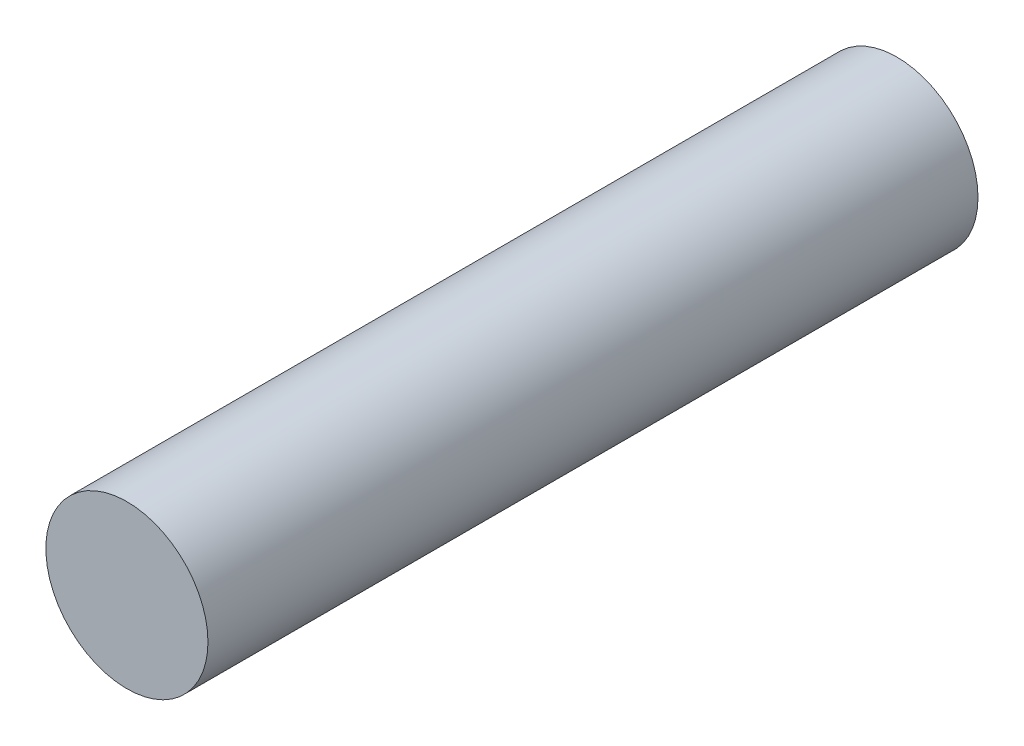
ISO-10303-21;
HEADER;
FILE_DESCRIPTION(('STEP AP214'),'2;1');
FILE_NAME('part.step','',(''),(''),'','','');
FILE_SCHEMA(('AUTOMOTIVE_DESIGN { 1 0 10303 214 1 1 1 1 }'));
ENDSEC;
DATA;
#1=APPLICATION_CONTEXT('core data for automotive mechanical design processes');
#2=APPLICATION_PROTOCOL_DEFINITION('international standard','automotive_design',2000,#1);
#3=PRODUCT_CONTEXT('',#1,'mechanical');
#4=PRODUCT('Part','Part','',(#3));
#5=PRODUCT_RELATED_PRODUCT_CATEGORY('part','',(#4));
#6=PRODUCT_DEFINITION_FORMATION('','',#4);
#7=PRODUCT_DEFINITION_CONTEXT('part definition',#1,'design');
#8=PRODUCT_DEFINITION('design','',#6,#7);
#9=PRODUCT_DEFINITION_SHAPE('','',#8);
#10=(LENGTH_UNIT() NAMED_UNIT(*) SI_UNIT(.MILLI.,.METRE.));
#11=(NAMED_UNIT(*) PLANE_ANGLE_UNIT() SI_UNIT($,.RADIAN.));
#12=(NAMED_UNIT(*) SI_UNIT($,.STERADIAN.) SOLID_ANGLE_UNIT());
#13=UNCERTAINTY_MEASURE_WITH_UNIT(LENGTH_MEASURE(1.E-05),#10,'distance_accuracy_value','');
#14=(GEOMETRIC_REPRESENTATION_CONTEXT(3) GLOBAL_UNCERTAINTY_ASSIGNED_CONTEXT((#13)) GLOBAL_UNIT_ASSIGNED_CONTEXT((#10,
#11,#12)) REPRESENTATION_CONTEXT('',''));
#15=CARTESIAN_POINT('',(0.,0.,0.));
#16=DIRECTION('',(0.,0.,1.));
#17=DIRECTION('',(1.,0.,0.));
#18=AXIS2_PLACEMENT_3D('',#15,#16,#17);
#19=CARTESIAN_POINT('',(0.,0.,19.));
#20=DIRECTION('',(0.,0.,-1.));
#21=DIRECTION('',(-1.,0.,0.));
#22=AXIS2_PLACEMENT_3D('',#19,#20,#21);
#23=CYLINDRICAL_SURFACE('',#22,2.);
#24=CARTESIAN_POINT('',(0.,0.,19.));
#25=DIRECTION('',(0.,0.,1.));
#26=DIRECTION('',(1.,0.,0.));
#27=AXIS2_PLACEMENT_3D('',#24,#25,#26);
#28=CIRCLE('',#27,2.);
#29=CARTESIAN_POINT('',(2.,0.,19.));
#30=VERTEX_POINT('',#29);
#31=EDGE_CURVE('E10',#30,#30,#28,.T.);
#32=ORIENTED_EDGE('',*,*,#31,.F.);
#33=EDGE_LOOP('',(#32));
#34=FACE_BOUND('',#33,.T.);
#35=CARTESIAN_POINT('',(0.,0.,0.));
#36=DIRECTION('',(0.,0.,1.));
#37=DIRECTION('',(1.,0.,0.));
#38=AXIS2_PLACEMENT_3D('',#35,#36,#37);
#39=CIRCLE('',#38,2.);
#40=CARTESIAN_POINT('',(2.,0.,0.));
#41=VERTEX_POINT('',#40);
#42=EDGE_CURVE('E40',#41,#41,#39,.T.);
#43=ORIENTED_EDGE('',*,*,#42,.T.);
#44=EDGE_LOOP('',(#43));
#45=FACE_BOUND('',#44,.T.);
#46=ADVANCED_FACE('F37',(#34,#45),#23,.T.);
#47=CARTESIAN_POINT('',(0.,0.,19.));
#48=DIRECTION('',(0.,0.,1.));
#49=DIRECTION('',(1.,0.,0.));
#50=AXIS2_PLACEMENT_3D('',#47,#48,#49);
#51=PLANE('',#50);
#52=ORIENTED_EDGE('',*,*,#31,.T.);
#53=EDGE_LOOP('',(#52));
#54=FACE_BOUND('',#53,.T.);
#55=ADVANCED_FACE('F52',(#54),#51,.T.);
#56=CARTESIAN_POINT('',(0.,0.,0.));
#57=DIRECTION('',(0.,0.,1.));
#58=DIRECTION('',(1.,0.,0.));
#59=AXIS2_PLACEMENT_3D('',#56,#57,#58);
#60=PLANE('',#59);
#61=ORIENTED_EDGE('',*,*,#42,.F.);
#62=EDGE_LOOP('',(#61));
#63=FACE_BOUND('',#62,.T.);
#64=ADVANCED_FACE('F50',(#63),#60,.F.);
#65=CLOSED_SHELL('',(#46,#55,#64));
#66=MANIFOLD_SOLID_BREP('B2',#65);
#67=ADVANCED_BREP_SHAPE_REPRESENTATION('',(#18,#66),#14);
#68=SHAPE_DEFINITION_REPRESENTATION(#9,#67);
ENDSEC;
END-ISO-10303-21;
